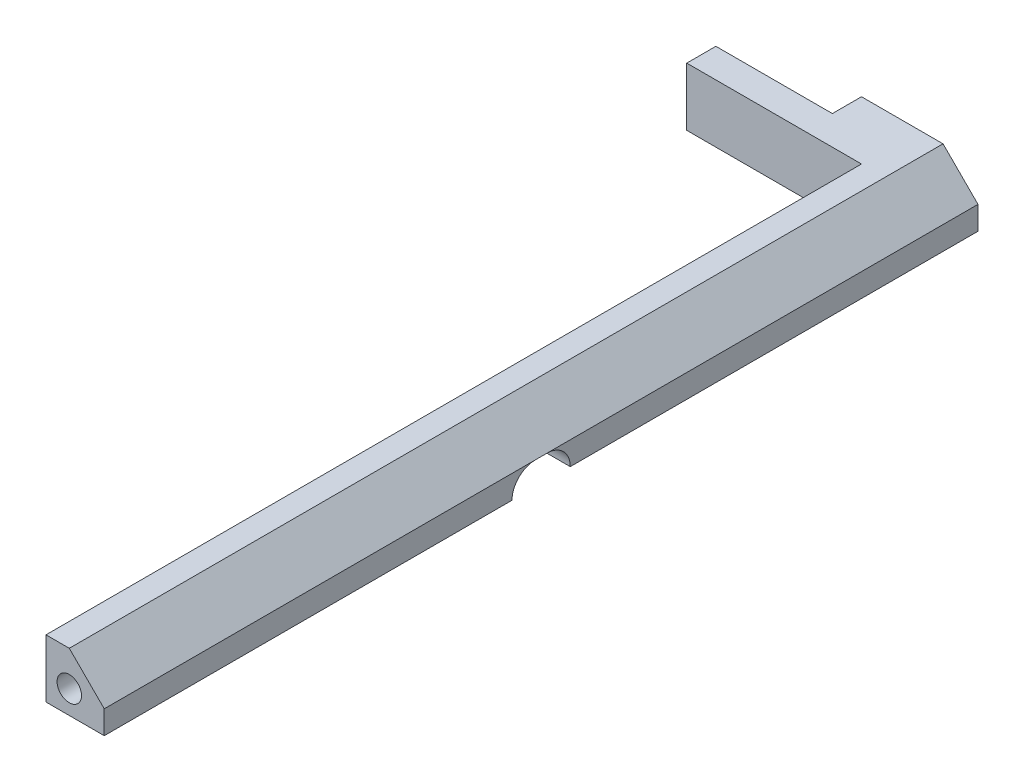
ISO-10303-21;
HEADER;
FILE_DESCRIPTION(('STEP AP214'),'2;1');
FILE_NAME('part.step','',(''),(''),'','','');
FILE_SCHEMA(('AUTOMOTIVE_DESIGN { 1 0 10303 214 1 1 1 1 }'));
ENDSEC;
DATA;
#1=APPLICATION_CONTEXT('core data for automotive mechanical design processes');
#2=APPLICATION_PROTOCOL_DEFINITION('international standard','automotive_design',2000,#1);
#3=PRODUCT_CONTEXT('',#1,'mechanical');
#4=PRODUCT('Part','Part','',(#3));
#5=PRODUCT_RELATED_PRODUCT_CATEGORY('part','',(#4));
#6=PRODUCT_DEFINITION_FORMATION('','',#4);
#7=PRODUCT_DEFINITION_CONTEXT('part definition',#1,'design');
#8=PRODUCT_DEFINITION('design','',#6,#7);
#9=PRODUCT_DEFINITION_SHAPE('','',#8);
#10=(LENGTH_UNIT() NAMED_UNIT(*) SI_UNIT(.MILLI.,.METRE.));
#11=(NAMED_UNIT(*) PLANE_ANGLE_UNIT() SI_UNIT($,.RADIAN.));
#12=(NAMED_UNIT(*) SI_UNIT($,.STERADIAN.) SOLID_ANGLE_UNIT());
#13=UNCERTAINTY_MEASURE_WITH_UNIT(LENGTH_MEASURE(1.E-05),#10,'distance_accuracy_value','');
#14=(GEOMETRIC_REPRESENTATION_CONTEXT(3) GLOBAL_UNCERTAINTY_ASSIGNED_CONTEXT((#13)) GLOBAL_UNIT_ASSIGNED_CONTEXT((#10,
#11,#12)) REPRESENTATION_CONTEXT('',''));
#15=CARTESIAN_POINT('',(0.,0.,0.));
#16=DIRECTION('',(0.,0.,1.));
#17=DIRECTION('',(1.,0.,0.));
#18=AXIS2_PLACEMENT_3D('',#15,#16,#17);
#19=CARTESIAN_POINT('',(0.,10.,0.));
#20=DIRECTION('',(-1.,0.,0.));
#21=DIRECTION('',(0.,0.,1.));
#22=AXIS2_PLACEMENT_3D('',#19,#20,#21);
#23=PLANE('',#22);
#24=DIRECTION('',(0.,0.,-1.));
#25=VECTOR('',#24,1.);
#26=CARTESIAN_POINT('',(0.,0.,0.));
#27=LINE('',#26,#25);
#28=CARTESIAN_POINT('',(0.,0.,0.));
#29=VERTEX_POINT('',#28);
#30=CARTESIAN_POINT('',(0.,0.,-70.));
#31=VERTEX_POINT('',#30);
#32=EDGE_CURVE('E225',#29,#31,#27,.T.);
#33=ORIENTED_EDGE('',*,*,#32,.T.);
#34=CARTESIAN_POINT('',(0.,0.,-74.));
#35=DIRECTION('',(-1.,0.,0.));
#36=DIRECTION('',(0.,0.,1.));
#37=AXIS2_PLACEMENT_3D('',#34,#35,#36);
#38=CIRCLE('',#37,4.);
#39=CARTESIAN_POINT('',(0.,4.,-74.));
#40=VERTEX_POINT('',#39);
#41=EDGE_CURVE('E11',#31,#40,#38,.T.);
#42=ORIENTED_EDGE('',*,*,#41,.T.);
#43=DIRECTION('',(0.,0.,1.));
#44=VECTOR('',#43,1.);
#45=CARTESIAN_POINT('',(0.,3.99999999999997,0.));
#46=LINE('',#45,#44);
#47=CARTESIAN_POINT('',(0.,3.99999999999997,0.));
#48=VERTEX_POINT('',#47);
#49=EDGE_CURVE('E58',#40,#48,#46,.T.);
#50=ORIENTED_EDGE('',*,*,#49,.T.);
#51=DIRECTION('',(0.,-1.,0.));
#52=VECTOR('',#51,1.);
#53=CARTESIAN_POINT('',(0.,10.,0.));
#54=LINE('',#53,#52);
#55=EDGE_CURVE('E270',#48,#29,#54,.T.);
#56=ORIENTED_EDGE('',*,*,#55,.T.);
#57=EDGE_LOOP('',(#33,#42,#50,#56));
#58=FACE_BOUND('',#57,.T.);
#59=ADVANCED_FACE('F42',(#58),#23,.F.);
#60=CARTESIAN_POINT('',(0.,0.,0.));
#61=DIRECTION('',(0.,1.,0.));
#62=DIRECTION('',(0.,0.,1.));
#63=AXIS2_PLACEMENT_3D('',#60,#61,#62);
#64=PLANE('',#63);
#65=CARTESIAN_POINT('',(-7.2,0.,-27.));
#66=DIRECTION('',(0.,-1.,0.));
#67=DIRECTION('',(0.,0.,-1.));
#68=AXIS2_PLACEMENT_3D('',#65,#66,#67);
#69=CIRCLE('',#68,2.1);
#70=CARTESIAN_POINT('',(-7.2,0.,-29.1));
#71=VERTEX_POINT('',#70);
#72=EDGE_CURVE('E179',#71,#71,#69,.T.);
#73=ORIENTED_EDGE('',*,*,#72,.F.);
#74=EDGE_LOOP('',(#73));
#75=FACE_BOUND('',#74,.T.);
#76=DIRECTION('',(0.,0.,1.));
#77=VECTOR('',#76,1.);
#78=CARTESIAN_POINT('',(-10.,0.,-140.));
#79=LINE('',#78,#77);
#80=CARTESIAN_POINT('',(-10.,0.,-70.));
#81=VERTEX_POINT('',#80);
#82=CARTESIAN_POINT('',(-10.,0.,0.));
#83=VERTEX_POINT('',#82);
#84=EDGE_CURVE('E142',#81,#83,#79,.T.);
#85=ORIENTED_EDGE('',*,*,#84,.F.);
#86=DIRECTION('',(-1.,0.,0.));
#87=VECTOR('',#86,1.);
#88=CARTESIAN_POINT('',(0.,0.,-70.));
#89=LINE('',#88,#87);
#90=EDGE_CURVE('E156',#31,#81,#89,.T.);
#91=ORIENTED_EDGE('',*,*,#90,.F.);
#92=ORIENTED_EDGE('',*,*,#32,.F.);
#93=DIRECTION('',(1.,0.,0.));
#94=VECTOR('',#93,1.);
#95=CARTESIAN_POINT('',(-10.,0.,0.));
#96=LINE('',#95,#94);
#97=EDGE_CURVE('E159',#83,#29,#96,.T.);
#98=ORIENTED_EDGE('',*,*,#97,.F.);
#99=EDGE_LOOP('',(#85,#91,#92,#98));
#100=FACE_BOUND('',#99,.T.);
#101=ADVANCED_FACE('F154',(#75,#100),#64,.F.);
#102=CARTESIAN_POINT('',(-10.,10.,0.));
#103=DIRECTION('',(0.,0.,-1.));
#104=DIRECTION('',(-1.,0.,0.));
#105=AXIS2_PLACEMENT_3D('',#102,#103,#104);
#106=PLANE('',#105);
#107=CARTESIAN_POINT('',(-6.,4.,0.));
#108=DIRECTION('',(0.,0.,1.));
#109=DIRECTION('',(1.,0.,0.));
#110=AXIS2_PLACEMENT_3D('',#107,#108,#109);
#111=CIRCLE('',#110,2.1);
#112=CARTESIAN_POINT('',(-3.9,4.,0.));
#113=VERTEX_POINT('',#112);
#114=EDGE_CURVE('E180',#113,#113,#111,.T.);
#115=ORIENTED_EDGE('',*,*,#114,.F.);
#116=EDGE_LOOP('',(#115));
#117=FACE_BOUND('',#116,.T.);
#118=ORIENTED_EDGE('',*,*,#55,.F.);
#119=DIRECTION('',(-0.707106781186546,0.707106781186549,0.));
#120=VECTOR('',#119,1.);
#121=CARTESIAN_POINT('',(-6.00000000000001,10.,0.));
#122=LINE('',#121,#120);
#123=CARTESIAN_POINT('',(-6.00000000000001,10.,0.));
#124=VERTEX_POINT('',#123);
#125=EDGE_CURVE('E282',#48,#124,#122,.T.);
#126=ORIENTED_EDGE('',*,*,#125,.T.);
#127=DIRECTION('',(1.,0.,0.));
#128=VECTOR('',#127,1.);
#129=CARTESIAN_POINT('',(-10.,10.,0.));
#130=LINE('',#129,#128);
#131=CARTESIAN_POINT('',(-10.,10.,0.));
#132=VERTEX_POINT('',#131);
#133=EDGE_CURVE('E199',#132,#124,#130,.T.);
#134=ORIENTED_EDGE('',*,*,#133,.F.);
#135=DIRECTION('',(0.,-1.,0.));
#136=VECTOR('',#135,1.);
#137=CARTESIAN_POINT('',(-10.,10.,0.));
#138=LINE('',#137,#136);
#139=EDGE_CURVE('E221',#132,#83,#138,.T.);
#140=ORIENTED_EDGE('',*,*,#139,.T.);
#141=ORIENTED_EDGE('',*,*,#97,.T.);
#142=EDGE_LOOP('',(#118,#126,#134,#140,#141));
#143=FACE_BOUND('',#142,.T.);
#144=ADVANCED_FACE('F315',(#117,#143),#106,.F.);
#145=CARTESIAN_POINT('',(0.,3.99999999999997,-150.));
#146=VERTEX_POINT('',#145);
#147=CARTESIAN_POINT('',(0.,3.99999999999997,-76.));
#148=VERTEX_POINT('',#147);
#149=EDGE_CURVE('E66',#146,#148,#46,.T.);
#150=ORIENTED_EDGE('',*,*,#149,.T.);
#151=CARTESIAN_POINT('',(0.,0.,-76.));
#152=DIRECTION('',(-1.,0.,0.));
#153=DIRECTION('',(0.,0.,1.));
#154=AXIS2_PLACEMENT_3D('',#151,#152,#153);
#155=CIRCLE('',#154,4.);
#156=CARTESIAN_POINT('',(0.,0.,-80.));
#157=VERTEX_POINT('',#156);
#158=EDGE_CURVE('E292',#148,#157,#155,.T.);
#159=ORIENTED_EDGE('',*,*,#158,.T.);
#160=CARTESIAN_POINT('',(0.,0.,-150.));
#161=VERTEX_POINT('',#160);
#162=EDGE_CURVE('E224',#157,#161,#27,.T.);
#163=ORIENTED_EDGE('',*,*,#162,.T.);
#164=DIRECTION('',(0.,-1.,0.));
#165=VECTOR('',#164,1.);
#166=CARTESIAN_POINT('',(0.,10.,-150.));
#167=LINE('',#166,#165);
#168=EDGE_CURVE('E266',#146,#161,#167,.T.);
#169=ORIENTED_EDGE('',*,*,#168,.F.);
#170=EDGE_LOOP('',(#150,#159,#163,#169));
#171=FACE_BOUND('',#170,.T.);
#172=ADVANCED_FACE('F305',(#171),#23,.F.);
#173=CARTESIAN_POINT('',(0.,10.,-150.));
#174=DIRECTION('',(0.,0.,1.));
#175=DIRECTION('',(1.,0.,0.));
#176=AXIS2_PLACEMENT_3D('',#173,#174,#175);
#177=PLANE('',#176);
#178=DIRECTION('',(-1.,0.,0.));
#179=VECTOR('',#178,1.);
#180=CARTESIAN_POINT('',(0.,10.,-150.));
#181=LINE('',#180,#179);
#182=CARTESIAN_POINT('',(-6.00000000000001,10.,-150.));
#183=VERTEX_POINT('',#182);
#184=CARTESIAN_POINT('',(-20.,10.,-150.));
#185=VERTEX_POINT('',#184);
#186=EDGE_CURVE('E203',#183,#185,#181,.T.);
#187=ORIENTED_EDGE('',*,*,#186,.F.);
#188=DIRECTION('',(0.707106781186546,-0.707106781186549,0.));
#189=VECTOR('',#188,1.);
#190=CARTESIAN_POINT('',(-6.00000000000001,10.,-150.));
#191=LINE('',#190,#189);
#192=EDGE_CURVE('E277',#183,#146,#191,.T.);
#193=ORIENTED_EDGE('',*,*,#192,.T.);
#194=ORIENTED_EDGE('',*,*,#168,.T.);
#195=DIRECTION('',(-1.,0.,0.));
#196=VECTOR('',#195,1.);
#197=CARTESIAN_POINT('',(0.,0.,-150.));
#198=LINE('',#197,#196);
#199=CARTESIAN_POINT('',(-20.,0.,-150.));
#200=VERTEX_POINT('',#199);
#201=EDGE_CURVE('E228',#161,#200,#198,.T.);
#202=ORIENTED_EDGE('',*,*,#201,.T.);
#203=DIRECTION('',(0.,-1.,0.));
#204=VECTOR('',#203,1.);
#205=CARTESIAN_POINT('',(-20.,10.,-150.));
#206=LINE('',#205,#204);
#207=EDGE_CURVE('E262',#185,#200,#206,.T.);
#208=ORIENTED_EDGE('',*,*,#207,.F.);
#209=EDGE_LOOP('',(#187,#193,#194,#202,#208));
#210=FACE_BOUND('',#209,.T.);
#211=ADVANCED_FACE('F343',(#210),#177,.F.);
#212=CARTESIAN_POINT('',(-20.,10.,-150.));
#213=DIRECTION('',(1.,0.,0.));
#214=DIRECTION('',(0.,0.,-1.));
#215=AXIS2_PLACEMENT_3D('',#212,#213,#214);
#216=PLANE('',#215);
#217=DIRECTION('',(0.,0.,1.));
#218=VECTOR('',#217,1.);
#219=CARTESIAN_POINT('',(-20.,0.,-150.));
#220=LINE('',#219,#218);
#221=CARTESIAN_POINT('',(-20.,0.,-145.));
#222=VERTEX_POINT('',#221);
#223=EDGE_CURVE('E231',#200,#222,#220,.T.);
#224=ORIENTED_EDGE('',*,*,#223,.T.);
#225=DIRECTION('',(0.,-1.,0.));
#226=VECTOR('',#225,1.);
#227=CARTESIAN_POINT('',(-20.,10.,-145.));
#228=LINE('',#227,#226);
#229=CARTESIAN_POINT('',(-20.,10.,-145.));
#230=VERTEX_POINT('',#229);
#231=EDGE_CURVE('E258',#230,#222,#228,.T.);
#232=ORIENTED_EDGE('',*,*,#231,.F.);
#233=DIRECTION('',(0.,0.,1.));
#234=VECTOR('',#233,1.);
#235=CARTESIAN_POINT('',(-20.,10.,-150.));
#236=LINE('',#235,#234);
#237=EDGE_CURVE('E206',#185,#230,#236,.T.);
#238=ORIENTED_EDGE('',*,*,#237,.F.);
#239=ORIENTED_EDGE('',*,*,#207,.T.);
#240=EDGE_LOOP('',(#224,#232,#238,#239));
#241=FACE_BOUND('',#240,.T.);
#242=ADVANCED_FACE('F339',(#241),#216,.F.);
#243=CARTESIAN_POINT('',(-40.,10.,-145.));
#244=DIRECTION('',(0.,0.,1.));
#245=DIRECTION('',(1.,0.,0.));
#246=AXIS2_PLACEMENT_3D('',#243,#244,#245);
#247=PLANE('',#246);
#248=DIRECTION('',(-1.,0.,0.));
#249=VECTOR('',#248,1.);
#250=CARTESIAN_POINT('',(-40.,0.,-145.));
#251=LINE('',#250,#249);
#252=CARTESIAN_POINT('',(-40.,0.,-145.));
#253=VERTEX_POINT('',#252);
#254=EDGE_CURVE('E234',#222,#253,#251,.T.);
#255=ORIENTED_EDGE('',*,*,#254,.T.);
#256=DIRECTION('',(0.,-1.,0.));
#257=VECTOR('',#256,1.);
#258=CARTESIAN_POINT('',(-40.,10.,-145.));
#259=LINE('',#258,#257);
#260=CARTESIAN_POINT('',(-40.,10.,-145.));
#261=VERTEX_POINT('',#260);
#262=EDGE_CURVE('E254',#261,#253,#259,.T.);
#263=ORIENTED_EDGE('',*,*,#262,.F.);
#264=DIRECTION('',(-1.,0.,0.));
#265=VECTOR('',#264,1.);
#266=CARTESIAN_POINT('',(-40.,10.,-145.));
#267=LINE('',#266,#265);
#268=EDGE_CURVE('E209',#230,#261,#267,.T.);
#269=ORIENTED_EDGE('',*,*,#268,.F.);
#270=ORIENTED_EDGE('',*,*,#231,.T.);
#271=EDGE_LOOP('',(#255,#263,#269,#270));
#272=FACE_BOUND('',#271,.T.);
#273=ADVANCED_FACE('F335',(#272),#247,.F.);
#274=CARTESIAN_POINT('',(-40.,10.,-140.));
#275=DIRECTION('',(1.,0.,0.));
#276=DIRECTION('',(0.,0.,-1.));
#277=AXIS2_PLACEMENT_3D('',#274,#275,#276);
#278=PLANE('',#277);
#279=DIRECTION('',(0.,0.,1.));
#280=VECTOR('',#279,1.);
#281=CARTESIAN_POINT('',(-40.,0.,-140.));
#282=LINE('',#281,#280);
#283=CARTESIAN_POINT('',(-40.,0.,-140.));
#284=VERTEX_POINT('',#283);
#285=EDGE_CURVE('E237',#253,#284,#282,.T.);
#286=ORIENTED_EDGE('',*,*,#285,.T.);
#287=DIRECTION('',(0.,-1.,0.));
#288=VECTOR('',#287,1.);
#289=CARTESIAN_POINT('',(-40.,10.,-140.));
#290=LINE('',#289,#288);
#291=CARTESIAN_POINT('',(-40.,10.,-140.));
#292=VERTEX_POINT('',#291);
#293=EDGE_CURVE('E250',#292,#284,#290,.T.);
#294=ORIENTED_EDGE('',*,*,#293,.F.);
#295=DIRECTION('',(0.,0.,1.));
#296=VECTOR('',#295,1.);
#297=CARTESIAN_POINT('',(-40.,10.,-140.));
#298=LINE('',#297,#296);
#299=EDGE_CURVE('E212',#261,#292,#298,.T.);
#300=ORIENTED_EDGE('',*,*,#299,.F.);
#301=ORIENTED_EDGE('',*,*,#262,.T.);
#302=EDGE_LOOP('',(#286,#294,#300,#301));
#303=FACE_BOUND('',#302,.T.);
#304=ADVANCED_FACE('F331',(#303),#278,.F.);
#305=CARTESIAN_POINT('',(-40.,10.,-140.));
#306=DIRECTION('',(0.,0.,-1.));
#307=DIRECTION('',(-1.,0.,0.));
#308=AXIS2_PLACEMENT_3D('',#305,#306,#307);
#309=PLANE('',#308);
#310=DIRECTION('',(1.,0.,0.));
#311=VECTOR('',#310,1.);
#312=CARTESIAN_POINT('',(-40.,0.,-140.));
#313=LINE('',#312,#311);
#314=CARTESIAN_POINT('',(-10.,0.,-140.));
#315=VERTEX_POINT('',#314);
#316=EDGE_CURVE('E162',#284,#315,#313,.T.);
#317=ORIENTED_EDGE('',*,*,#316,.T.);
#318=DIRECTION('',(0.,-1.,0.));
#319=VECTOR('',#318,1.);
#320=CARTESIAN_POINT('',(-10.,10.,-140.));
#321=LINE('',#320,#319);
#322=CARTESIAN_POINT('',(-10.,10.,-140.));
#323=VERTEX_POINT('',#322);
#324=EDGE_CURVE('E246',#323,#315,#321,.T.);
#325=ORIENTED_EDGE('',*,*,#324,.F.);
#326=DIRECTION('',(1.,0.,0.));
#327=VECTOR('',#326,1.);
#328=CARTESIAN_POINT('',(-40.,10.,-140.));
#329=LINE('',#328,#327);
#330=EDGE_CURVE('E215',#292,#323,#329,.T.);
#331=ORIENTED_EDGE('',*,*,#330,.F.);
#332=ORIENTED_EDGE('',*,*,#293,.T.);
#333=EDGE_LOOP('',(#317,#325,#331,#332));
#334=FACE_BOUND('',#333,.T.);
#335=ADVANCED_FACE('F326',(#334),#309,.F.);
#336=CARTESIAN_POINT('',(-10.,10.,-140.));
#337=DIRECTION('',(1.,0.,0.));
#338=DIRECTION('',(0.,0.,-1.));
#339=AXIS2_PLACEMENT_3D('',#336,#337,#338);
#340=PLANE('',#339);
#341=DIRECTION('',(0.,0.,-1.));
#342=VECTOR('',#341,1.);
#343=CARTESIAN_POINT('',(-10.,4.,-70.));
#344=LINE('',#343,#342);
#345=CARTESIAN_POINT('',(-10.,4.,-74.));
#346=VERTEX_POINT('',#345);
#347=CARTESIAN_POINT('',(-10.,4.,-76.));
#348=VERTEX_POINT('',#347);
#349=EDGE_CURVE('E145',#346,#348,#344,.T.);
#350=ORIENTED_EDGE('',*,*,#349,.F.);
#351=CARTESIAN_POINT('',(-10.,0.,-74.));
#352=DIRECTION('',(1.,0.,0.));
#353=DIRECTION('',(0.,0.,-1.));
#354=AXIS2_PLACEMENT_3D('',#351,#352,#353);
#355=CIRCLE('',#354,4.);
#356=EDGE_CURVE('E51',#346,#81,#355,.T.);
#357=ORIENTED_EDGE('',*,*,#356,.T.);
#358=ORIENTED_EDGE('',*,*,#84,.T.);
#359=ORIENTED_EDGE('',*,*,#139,.F.);
#360=DIRECTION('',(0.,0.,1.));
#361=VECTOR('',#360,1.);
#362=CARTESIAN_POINT('',(-10.,10.,-140.));
#363=LINE('',#362,#361);
#364=EDGE_CURVE('E218',#323,#132,#363,.T.);
#365=ORIENTED_EDGE('',*,*,#364,.F.);
#366=ORIENTED_EDGE('',*,*,#324,.T.);
#367=CARTESIAN_POINT('',(-10.,0.,-80.));
#368=VERTEX_POINT('',#367);
#369=EDGE_CURVE('E161',#315,#368,#79,.T.);
#370=ORIENTED_EDGE('',*,*,#369,.T.);
#371=CARTESIAN_POINT('',(-10.,0.,-76.));
#372=DIRECTION('',(1.,0.,0.));
#373=DIRECTION('',(0.,0.,-1.));
#374=AXIS2_PLACEMENT_3D('',#371,#372,#373);
#375=CIRCLE('',#374,4.);
#376=EDGE_CURVE('E151',#368,#348,#375,.T.);
#377=ORIENTED_EDGE('',*,*,#376,.T.);
#378=EDGE_LOOP('',(#350,#357,#358,#359,#365,#366,#370,#377));
#379=FACE_BOUND('',#378,.T.);
#380=ADVANCED_FACE('F140',(#379),#340,.F.);
#381=CARTESIAN_POINT('',(0.,10.,0.));
#382=DIRECTION('',(0.,1.,0.));
#383=DIRECTION('',(0.,0.,1.));
#384=AXIS2_PLACEMENT_3D('',#381,#382,#383);
#385=PLANE('',#384);
#386=ORIENTED_EDGE('',*,*,#133,.T.);
#387=DIRECTION('',(0.,0.,-1.));
#388=VECTOR('',#387,1.);
#389=CARTESIAN_POINT('',(-6.00000000000001,10.,-150.));
#390=LINE('',#389,#388);
#391=EDGE_CURVE('E273',#124,#183,#390,.T.);
#392=ORIENTED_EDGE('',*,*,#391,.T.);
#393=ORIENTED_EDGE('',*,*,#186,.T.);
#394=ORIENTED_EDGE('',*,*,#237,.T.);
#395=ORIENTED_EDGE('',*,*,#268,.T.);
#396=ORIENTED_EDGE('',*,*,#299,.T.);
#397=ORIENTED_EDGE('',*,*,#330,.T.);
#398=ORIENTED_EDGE('',*,*,#364,.T.);
#399=EDGE_LOOP('',(#386,#392,#393,#394,#395,#396,#397,#398));
#400=FACE_BOUND('',#399,.T.);
#401=ADVANCED_FACE('F320',(#400),#385,.T.);
#402=CARTESIAN_POINT('',(-7.19999999999998,0.,-123.));
#403=DIRECTION('',(0.,-1.,0.));
#404=DIRECTION('',(0.,0.,-1.));
#405=AXIS2_PLACEMENT_3D('',#402,#403,#404);
#406=CIRCLE('',#405,2.10000000000001);
#407=CARTESIAN_POINT('',(-7.19999999999998,0.,-125.1));
#408=VERTEX_POINT('',#407);
#409=EDGE_CURVE('E188',#408,#408,#406,.T.);
#410=ORIENTED_EDGE('',*,*,#409,.F.);
#411=EDGE_LOOP('',(#410));
#412=FACE_BOUND('',#411,.T.);
#413=ORIENTED_EDGE('',*,*,#162,.F.);
#414=DIRECTION('',(1.,0.,0.));
#415=VECTOR('',#414,1.);
#416=CARTESIAN_POINT('',(-10.,0.,-80.));
#417=LINE('',#416,#415);
#418=EDGE_CURVE('E166',#368,#157,#417,.T.);
#419=ORIENTED_EDGE('',*,*,#418,.F.);
#420=ORIENTED_EDGE('',*,*,#369,.F.);
#421=ORIENTED_EDGE('',*,*,#316,.F.);
#422=ORIENTED_EDGE('',*,*,#285,.F.);
#423=ORIENTED_EDGE('',*,*,#254,.F.);
#424=ORIENTED_EDGE('',*,*,#223,.F.);
#425=ORIENTED_EDGE('',*,*,#201,.F.);
#426=EDGE_LOOP('',(#413,#419,#420,#421,#422,#423,#424,#425));
#427=FACE_BOUND('',#426,.T.);
#428=ADVANCED_FACE('F308',(#412,#427),#64,.F.);
#429=CARTESIAN_POINT('',(-7.2,4.,-27.));
#430=DIRECTION('',(0.,-1.,0.));
#431=DIRECTION('',(0.,0.,-1.));
#432=AXIS2_PLACEMENT_3D('',#429,#430,#431);
#433=CYLINDRICAL_SURFACE('',#432,2.1);
#434=CARTESIAN_POINT('',(-7.2,4.,-27.));
#435=DIRECTION('',(0.,-1.,0.));
#436=DIRECTION('',(0.,0.,-1.));
#437=AXIS2_PLACEMENT_3D('',#434,#435,#436);
#438=CIRCLE('',#437,2.1);
#439=CARTESIAN_POINT('',(-7.2,4.,-29.1));
#440=VERTEX_POINT('',#439);
#441=EDGE_CURVE('E192',#440,#440,#438,.T.);
#442=ORIENTED_EDGE('',*,*,#441,.F.);
#443=EDGE_LOOP('',(#442));
#444=FACE_BOUND('',#443,.T.);
#445=ORIENTED_EDGE('',*,*,#72,.T.);
#446=EDGE_LOOP('',(#445));
#447=FACE_BOUND('',#446,.T.);
#448=ADVANCED_FACE('F398',(#444,#447),#433,.F.);
#449=CARTESIAN_POINT('',(-7.2,4.,-27.));
#450=DIRECTION('',(0.,-1.,0.));
#451=DIRECTION('',(0.,0.,-1.));
#452=AXIS2_PLACEMENT_3D('',#449,#450,#451);
#453=PLANE('',#452);
#454=ORIENTED_EDGE('',*,*,#441,.T.);
#455=EDGE_LOOP('',(#454));
#456=FACE_BOUND('',#455,.T.);
#457=ADVANCED_FACE('F394',(#456),#453,.T.);
#458=CARTESIAN_POINT('',(-7.19999999999998,4.,-123.));
#459=DIRECTION('',(0.,-1.,0.));
#460=DIRECTION('',(0.,0.,-1.));
#461=AXIS2_PLACEMENT_3D('',#458,#459,#460);
#462=CYLINDRICAL_SURFACE('',#461,2.10000000000001);
#463=CARTESIAN_POINT('',(-7.19999999999998,4.,-123.));
#464=DIRECTION('',(0.,-1.,0.));
#465=DIRECTION('',(0.,0.,-1.));
#466=AXIS2_PLACEMENT_3D('',#463,#464,#465);
#467=CIRCLE('',#466,2.10000000000001);
#468=CARTESIAN_POINT('',(-7.19999999999998,4.,-125.1));
#469=VERTEX_POINT('',#468);
#470=EDGE_CURVE('E184',#469,#469,#467,.T.);
#471=ORIENTED_EDGE('',*,*,#470,.F.);
#472=EDGE_LOOP('',(#471));
#473=FACE_BOUND('',#472,.T.);
#474=ORIENTED_EDGE('',*,*,#409,.T.);
#475=EDGE_LOOP('',(#474));
#476=FACE_BOUND('',#475,.T.);
#477=ADVANCED_FACE('F387',(#473,#476),#462,.F.);
#478=CARTESIAN_POINT('',(-7.19999999999998,4.,-123.));
#479=DIRECTION('',(0.,-1.,0.));
#480=DIRECTION('',(0.,0.,-1.));
#481=AXIS2_PLACEMENT_3D('',#478,#479,#480);
#482=PLANE('',#481);
#483=ORIENTED_EDGE('',*,*,#470,.T.);
#484=EDGE_LOOP('',(#483));
#485=FACE_BOUND('',#484,.T.);
#486=ADVANCED_FACE('F381',(#485),#482,.T.);
#487=CARTESIAN_POINT('',(-6.,4.,-4.));
#488=DIRECTION('',(0.,0.,1.));
#489=DIRECTION('',(1.,0.,0.));
#490=AXIS2_PLACEMENT_3D('',#487,#488,#489);
#491=CYLINDRICAL_SURFACE('',#490,2.1);
#492=CARTESIAN_POINT('',(-6.,4.,-4.));
#493=DIRECTION('',(0.,0.,1.));
#494=DIRECTION('',(1.,0.,0.));
#495=AXIS2_PLACEMENT_3D('',#492,#493,#494);
#496=CIRCLE('',#495,2.1);
#497=CARTESIAN_POINT('',(-3.9,4.,-4.));
#498=VERTEX_POINT('',#497);
#499=EDGE_CURVE('E175',#498,#498,#496,.T.);
#500=ORIENTED_EDGE('',*,*,#499,.F.);
#501=EDGE_LOOP('',(#500));
#502=FACE_BOUND('',#501,.T.);
#503=ORIENTED_EDGE('',*,*,#114,.T.);
#504=EDGE_LOOP('',(#503));
#505=FACE_BOUND('',#504,.T.);
#506=ADVANCED_FACE('F355',(#502,#505),#491,.F.);
#507=CARTESIAN_POINT('',(-6.,4.,-4.));
#508=DIRECTION('',(0.,0.,1.));
#509=DIRECTION('',(1.,0.,0.));
#510=AXIS2_PLACEMENT_3D('',#507,#508,#509);
#511=PLANE('',#510);
#512=ORIENTED_EDGE('',*,*,#499,.T.);
#513=EDGE_LOOP('',(#512));
#514=FACE_BOUND('',#513,.T.);
#515=ADVANCED_FACE('F346',(#514),#511,.T.);
#516=CARTESIAN_POINT('',(-6.00000000000001,10.,0.));
#517=DIRECTION('',(0.707106781186549,0.707106781186546,0.));
#518=DIRECTION('',(0.,0.,1.));
#519=AXIS2_PLACEMENT_3D('',#516,#517,#518);
#520=PLANE('',#519);
#521=ORIENTED_EDGE('',*,*,#125,.F.);
#522=ORIENTED_EDGE('',*,*,#49,.F.);
#523=DIRECTION('',(0.,0.,1.));
#524=VECTOR('',#523,1.);
#525=CARTESIAN_POINT('',(0.,4.,-80.));
#526=LINE('',#525,#524);
#527=EDGE_CURVE('E172',#148,#40,#526,.T.);
#528=ORIENTED_EDGE('',*,*,#527,.F.);
#529=ORIENTED_EDGE('',*,*,#149,.F.);
#530=ORIENTED_EDGE('',*,*,#192,.F.);
#531=ORIENTED_EDGE('',*,*,#391,.F.);
#532=EDGE_LOOP('',(#521,#522,#528,#529,#530,#531));
#533=FACE_BOUND('',#532,.T.);
#534=ADVANCED_FACE('F344',(#533),#520,.T.);
#535=CARTESIAN_POINT('',(0.,4.,0.));
#536=DIRECTION('',(0.,-1.,0.));
#537=DIRECTION('',(0.,0.,-1.));
#538=AXIS2_PLACEMENT_3D('',#535,#536,#537);
#539=PLANE('',#538);
#540=ORIENTED_EDGE('',*,*,#349,.T.);
#541=DIRECTION('',(1.,0.,0.));
#542=VECTOR('',#541,1.);
#543=CARTESIAN_POINT('',(0.,4.,-76.));
#544=LINE('',#543,#542);
#545=EDGE_CURVE('E288',#348,#148,#544,.T.);
#546=ORIENTED_EDGE('',*,*,#545,.T.);
#547=ORIENTED_EDGE('',*,*,#527,.T.);
#548=DIRECTION('',(-1.,0.,0.));
#549=VECTOR('',#548,1.);
#550=CARTESIAN_POINT('',(1.02695629777827E-13,4.,-74.));
#551=LINE('',#550,#549);
#552=EDGE_CURVE('E285',#40,#346,#551,.T.);
#553=ORIENTED_EDGE('',*,*,#552,.T.);
#554=EDGE_LOOP('',(#540,#546,#547,#553));
#555=FACE_BOUND('',#554,.T.);
#556=ADVANCED_FACE('F301',(#555),#539,.T.);
#557=CARTESIAN_POINT('',(0.,0.,-76.));
#558=DIRECTION('',(1.,0.,0.));
#559=DIRECTION('',(0.,0.,-1.));
#560=AXIS2_PLACEMENT_3D('',#557,#558,#559);
#561=CYLINDRICAL_SURFACE('',#560,4.);
#562=ORIENTED_EDGE('',*,*,#376,.F.);
#563=ORIENTED_EDGE('',*,*,#418,.T.);
#564=ORIENTED_EDGE('',*,*,#158,.F.);
#565=ORIENTED_EDGE('',*,*,#545,.F.);
#566=EDGE_LOOP('',(#562,#563,#564,#565));
#567=FACE_BOUND('',#566,.T.);
#568=ADVANCED_FACE('F303',(#567),#561,.F.);
#569=CARTESIAN_POINT('',(1.02695629777827E-13,0.,-74.));
#570=DIRECTION('',(-1.,0.,0.));
#571=DIRECTION('',(0.,0.,1.));
#572=AXIS2_PLACEMENT_3D('',#569,#570,#571);
#573=CYLINDRICAL_SURFACE('',#572,4.);
#574=ORIENTED_EDGE('',*,*,#41,.F.);
#575=ORIENTED_EDGE('',*,*,#90,.T.);
#576=ORIENTED_EDGE('',*,*,#356,.F.);
#577=ORIENTED_EDGE('',*,*,#552,.F.);
#578=EDGE_LOOP('',(#574,#575,#576,#577));
#579=FACE_BOUND('',#578,.T.);
#580=ADVANCED_FACE('F44',(#579),#573,.F.);
#581=CLOSED_SHELL('',(#59,#101,#144,#172,#211,#242,#273,#304,#335,#380,#401,#428,#448,#457,#477,
#486,#506,#515,#534,#556,#568,#580));
#582=MANIFOLD_SOLID_BREP('B2',#581);
#583=ADVANCED_BREP_SHAPE_REPRESENTATION('',(#18,#582),#14);
#584=SHAPE_DEFINITION_REPRESENTATION(#9,#583);
ENDSEC;
END-ISO-10303-21;
